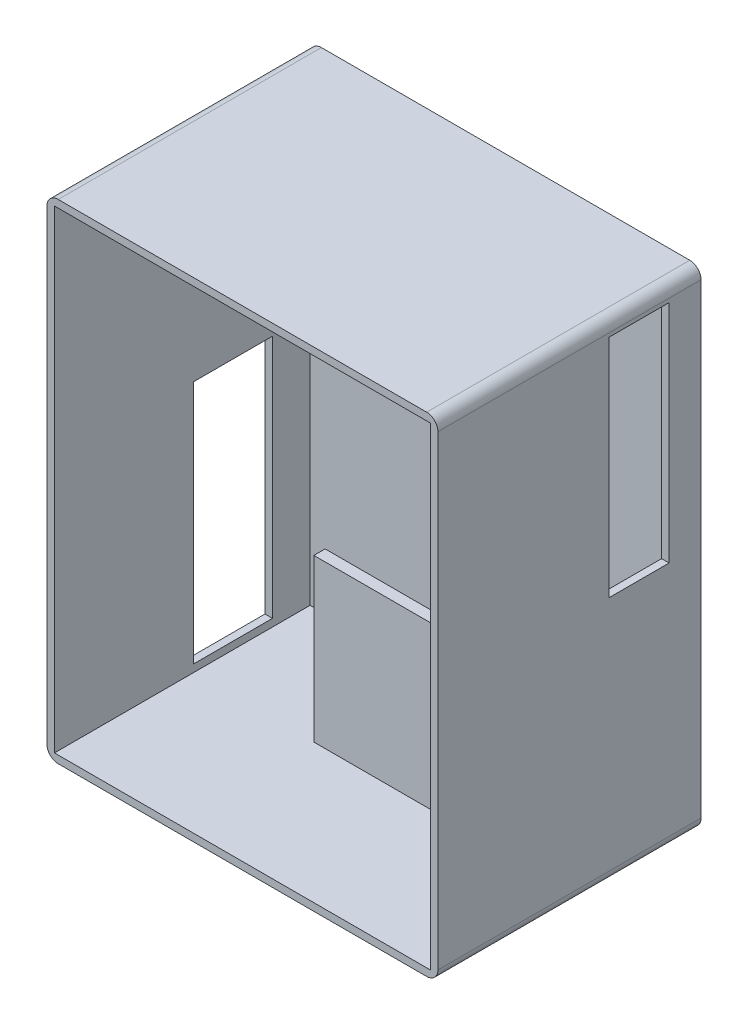
ISO-10303-21;
HEADER;
FILE_DESCRIPTION(('STEP AP214'),'2;1');
FILE_NAME('part.step','',(''),(''),'','','');
FILE_SCHEMA(('AUTOMOTIVE_DESIGN { 1 0 10303 214 1 1 1 1 }'));
ENDSEC;
DATA;
#1=APPLICATION_CONTEXT('core data for automotive mechanical design processes');
#2=APPLICATION_PROTOCOL_DEFINITION('international standard','automotive_design',2000,#1);
#3=PRODUCT_CONTEXT('',#1,'mechanical');
#4=PRODUCT('Part','Part','',(#3));
#5=PRODUCT_RELATED_PRODUCT_CATEGORY('part','',(#4));
#6=PRODUCT_DEFINITION_FORMATION('','',#4);
#7=PRODUCT_DEFINITION_CONTEXT('part definition',#1,'design');
#8=PRODUCT_DEFINITION('design','',#6,#7);
#9=PRODUCT_DEFINITION_SHAPE('','',#8);
#10=(LENGTH_UNIT() NAMED_UNIT(*) SI_UNIT(.MILLI.,.METRE.));
#11=(NAMED_UNIT(*) PLANE_ANGLE_UNIT() SI_UNIT($,.RADIAN.));
#12=(NAMED_UNIT(*) SI_UNIT($,.STERADIAN.) SOLID_ANGLE_UNIT());
#13=UNCERTAINTY_MEASURE_WITH_UNIT(LENGTH_MEASURE(1.E-05),#10,'distance_accuracy_value','');
#14=(GEOMETRIC_REPRESENTATION_CONTEXT(3) GLOBAL_UNCERTAINTY_ASSIGNED_CONTEXT((#13)) GLOBAL_UNIT_ASSIGNED_CONTEXT((#10,
#11,#12)) REPRESENTATION_CONTEXT('',''));
#15=CARTESIAN_POINT('',(0.,0.,0.));
#16=DIRECTION('',(0.,0.,1.));
#17=DIRECTION('',(1.,0.,0.));
#18=AXIS2_PLACEMENT_3D('',#15,#16,#17);
#19=CARTESIAN_POINT('',(52.,65.,70.));
#20=DIRECTION('',(-1.,0.,0.));
#21=DIRECTION('',(0.,-1.,0.));
#22=AXIS2_PLACEMENT_3D('',#19,#20,#21);
#23=PLANE('',#22);
#24=DIRECTION('',(0.,1.,0.));
#25=VECTOR('',#24,1.);
#26=CARTESIAN_POINT('',(52.,65.,0.));
#27=LINE('',#26,#25);
#28=CARTESIAN_POINT('',(52.,-62.,0.));
#29=VERTEX_POINT('',#28);
#30=CARTESIAN_POINT('',(52.,62.,0.));
#31=VERTEX_POINT('',#30);
#32=EDGE_CURVE('E307',#29,#31,#27,.T.);
#33=ORIENTED_EDGE('',*,*,#32,.T.);
#34=DIRECTION('',(0.,0.,-1.));
#35=VECTOR('',#34,1.);
#36=CARTESIAN_POINT('',(52.,62.,70.));
#37=LINE('',#36,#35);
#38=CARTESIAN_POINT('',(52.,62.,70.));
#39=VERTEX_POINT('',#38);
#40=EDGE_CURVE('E11',#31,#39,#37,.F.);
#41=ORIENTED_EDGE('',*,*,#40,.T.);
#42=DIRECTION('',(0.,1.,0.));
#43=VECTOR('',#42,1.);
#44=CARTESIAN_POINT('',(52.,65.,70.));
#45=LINE('',#44,#43);
#46=CARTESIAN_POINT('',(52.,-62.,70.));
#47=VERTEX_POINT('',#46);
#48=EDGE_CURVE('E343',#47,#39,#45,.T.);
#49=ORIENTED_EDGE('',*,*,#48,.F.);
#50=DIRECTION('',(0.,0.,-1.));
#51=VECTOR('',#50,1.);
#52=CARTESIAN_POINT('',(52.,-62.,70.));
#53=LINE('',#52,#51);
#54=EDGE_CURVE('E48',#47,#29,#53,.T.);
#55=ORIENTED_EDGE('',*,*,#54,.T.);
#56=EDGE_LOOP('',(#33,#41,#49,#55));
#57=FACE_BOUND('',#56,.T.);
#58=DIRECTION('',(0.,0.,1.));
#59=VECTOR('',#58,1.);
#60=CARTESIAN_POINT('',(52.,61.,24.5));
#61=LINE('',#60,#59);
#62=CARTESIAN_POINT('',(52.,61.,8.5));
#63=VERTEX_POINT('',#62);
#64=CARTESIAN_POINT('',(52.,61.,24.5));
#65=VERTEX_POINT('',#64);
#66=EDGE_CURVE('E245',#63,#65,#61,.T.);
#67=ORIENTED_EDGE('',*,*,#66,.F.);
#68=DIRECTION('',(0.,1.,0.));
#69=VECTOR('',#68,1.);
#70=CARTESIAN_POINT('',(52.,1.,8.5));
#71=LINE('',#70,#69);
#72=CARTESIAN_POINT('',(52.,1.,8.5));
#73=VERTEX_POINT('',#72);
#74=EDGE_CURVE('E242',#73,#63,#71,.T.);
#75=ORIENTED_EDGE('',*,*,#74,.F.);
#76=DIRECTION('',(0.,0.,-1.));
#77=VECTOR('',#76,1.);
#78=CARTESIAN_POINT('',(52.,1.,24.5));
#79=LINE('',#78,#77);
#80=CARTESIAN_POINT('',(52.,1.,24.5));
#81=VERTEX_POINT('',#80);
#82=EDGE_CURVE('E253',#81,#73,#79,.T.);
#83=ORIENTED_EDGE('',*,*,#82,.F.);
#84=DIRECTION('',(0.,-1.,0.));
#85=VECTOR('',#84,1.);
#86=CARTESIAN_POINT('',(52.,1.,24.5));
#87=LINE('',#86,#85);
#88=EDGE_CURVE('E249',#65,#81,#87,.T.);
#89=ORIENTED_EDGE('',*,*,#88,.F.);
#90=EDGE_LOOP('',(#67,#75,#83,#89));
#91=FACE_BOUND('',#90,.T.);
#92=ADVANCED_FACE('F39',(#57,#91),#23,.F.);
#93=CARTESIAN_POINT('',(-52.,65.,70.));
#94=DIRECTION('',(0.,-1.,0.));
#95=DIRECTION('',(0.,0.,-1.));
#96=AXIS2_PLACEMENT_3D('',#93,#94,#95);
#97=PLANE('',#96);
#98=DIRECTION('',(-1.,0.,0.));
#99=VECTOR('',#98,1.);
#100=CARTESIAN_POINT('',(-52.,65.,0.));
#101=LINE('',#100,#99);
#102=CARTESIAN_POINT('',(49.,65.,0.));
#103=VERTEX_POINT('',#102);
#104=CARTESIAN_POINT('',(-49.,65.,0.));
#105=VERTEX_POINT('',#104);
#106=EDGE_CURVE('E362',#103,#105,#101,.T.);
#107=ORIENTED_EDGE('',*,*,#106,.T.);
#108=DIRECTION('',(0.,0.,-1.));
#109=VECTOR('',#108,1.);
#110=CARTESIAN_POINT('',(-49.,65.,70.));
#111=LINE('',#110,#109);
#112=CARTESIAN_POINT('',(-49.,65.,70.));
#113=VERTEX_POINT('',#112);
#114=EDGE_CURVE('E55',#105,#113,#111,.F.);
#115=ORIENTED_EDGE('',*,*,#114,.T.);
#116=DIRECTION('',(-1.,0.,0.));
#117=VECTOR('',#116,1.);
#118=CARTESIAN_POINT('',(-52.,65.,70.));
#119=LINE('',#118,#117);
#120=CARTESIAN_POINT('',(49.,65.,70.));
#121=VERTEX_POINT('',#120);
#122=EDGE_CURVE('E346',#121,#113,#119,.T.);
#123=ORIENTED_EDGE('',*,*,#122,.F.);
#124=DIRECTION('',(0.,0.,-1.));
#125=VECTOR('',#124,1.);
#126=CARTESIAN_POINT('',(49.,65.,70.));
#127=LINE('',#126,#125);
#128=EDGE_CURVE('E445',#121,#103,#127,.T.);
#129=ORIENTED_EDGE('',*,*,#128,.T.);
#130=EDGE_LOOP('',(#107,#115,#123,#129));
#131=FACE_BOUND('',#130,.T.);
#132=ADVANCED_FACE('F467',(#131),#97,.F.);
#133=CARTESIAN_POINT('',(-52.,65.,70.));
#134=DIRECTION('',(1.,0.,0.));
#135=DIRECTION('',(0.,1.,0.));
#136=AXIS2_PLACEMENT_3D('',#133,#134,#135);
#137=PLANE('',#136);
#138=DIRECTION('',(0.,0.,1.));
#139=VECTOR('',#138,1.);
#140=CARTESIAN_POINT('',(-52.,-61.,33.));
#141=LINE('',#140,#139);
#142=CARTESIAN_POINT('',(-52.,-61.,12.));
#143=VERTEX_POINT('',#142);
#144=CARTESIAN_POINT('',(-52.,-61.,33.));
#145=VERTEX_POINT('',#144);
#146=EDGE_CURVE('E273',#143,#145,#141,.T.);
#147=ORIENTED_EDGE('',*,*,#146,.F.);
#148=DIRECTION('',(0.,-1.,0.));
#149=VECTOR('',#148,1.);
#150=CARTESIAN_POINT('',(-52.,4.,12.));
#151=LINE('',#150,#149);
#152=CARTESIAN_POINT('',(-52.,4.,12.));
#153=VERTEX_POINT('',#152);
#154=EDGE_CURVE('E261',#153,#143,#151,.T.);
#155=ORIENTED_EDGE('',*,*,#154,.F.);
#156=DIRECTION('',(0.,0.,-1.));
#157=VECTOR('',#156,1.);
#158=CARTESIAN_POINT('',(-52.,4.,33.));
#159=LINE('',#158,#157);
#160=CARTESIAN_POINT('',(-52.,4.,33.));
#161=VERTEX_POINT('',#160);
#162=EDGE_CURVE('E281',#161,#153,#159,.T.);
#163=ORIENTED_EDGE('',*,*,#162,.F.);
#164=DIRECTION('',(0.,1.,0.));
#165=VECTOR('',#164,1.);
#166=CARTESIAN_POINT('',(-52.,4.,33.));
#167=LINE('',#166,#165);
#168=EDGE_CURVE('E277',#145,#161,#167,.T.);
#169=ORIENTED_EDGE('',*,*,#168,.F.);
#170=EDGE_LOOP('',(#147,#155,#163,#169));
#171=FACE_BOUND('',#170,.T.);
#172=DIRECTION('',(0.,-1.,0.));
#173=VECTOR('',#172,1.);
#174=CARTESIAN_POINT('',(-52.,65.,0.));
#175=LINE('',#174,#173);
#176=CARTESIAN_POINT('',(-52.,62.,0.));
#177=VERTEX_POINT('',#176);
#178=CARTESIAN_POINT('',(-52.,-62.,0.));
#179=VERTEX_POINT('',#178);
#180=EDGE_CURVE('E365',#177,#179,#175,.T.);
#181=ORIENTED_EDGE('',*,*,#180,.T.);
#182=DIRECTION('',(0.,0.,-1.));
#183=VECTOR('',#182,1.);
#184=CARTESIAN_POINT('',(-52.,-62.,70.));
#185=LINE('',#184,#183);
#186=CARTESIAN_POINT('',(-52.,-62.,70.));
#187=VERTEX_POINT('',#186);
#188=EDGE_CURVE('E431',#179,#187,#185,.F.);
#189=ORIENTED_EDGE('',*,*,#188,.T.);
#190=DIRECTION('',(0.,-1.,0.));
#191=VECTOR('',#190,1.);
#192=CARTESIAN_POINT('',(-52.,65.,70.));
#193=LINE('',#192,#191);
#194=CARTESIAN_POINT('',(-52.,62.,70.));
#195=VERTEX_POINT('',#194);
#196=EDGE_CURVE('E350',#195,#187,#193,.T.);
#197=ORIENTED_EDGE('',*,*,#196,.F.);
#198=DIRECTION('',(0.,0.,-1.));
#199=VECTOR('',#198,1.);
#200=CARTESIAN_POINT('',(-52.,62.,70.));
#201=LINE('',#200,#199);
#202=EDGE_CURVE('E427',#195,#177,#201,.T.);
#203=ORIENTED_EDGE('',*,*,#202,.T.);
#204=EDGE_LOOP('',(#181,#189,#197,#203));
#205=FACE_BOUND('',#204,.T.);
#206=ADVANCED_FACE('F476',(#171,#205),#137,.F.);
#207=CARTESIAN_POINT('',(-52.,-65.,70.));
#208=DIRECTION('',(0.,1.,0.));
#209=DIRECTION('',(0.,0.,1.));
#210=AXIS2_PLACEMENT_3D('',#207,#208,#209);
#211=PLANE('',#210);
#212=DIRECTION('',(1.,0.,0.));
#213=VECTOR('',#212,1.);
#214=CARTESIAN_POINT('',(-52.,-65.,70.));
#215=LINE('',#214,#213);
#216=CARTESIAN_POINT('',(-49.,-65.,70.));
#217=VERTEX_POINT('',#216);
#218=CARTESIAN_POINT('',(49.,-65.,70.));
#219=VERTEX_POINT('',#218);
#220=EDGE_CURVE('E354',#217,#219,#215,.T.);
#221=ORIENTED_EDGE('',*,*,#220,.F.);
#222=DIRECTION('',(0.,0.,-1.));
#223=VECTOR('',#222,1.);
#224=CARTESIAN_POINT('',(-49.,-65.,70.));
#225=LINE('',#224,#223);
#226=CARTESIAN_POINT('',(-49.,-65.,0.));
#227=VERTEX_POINT('',#226);
#228=EDGE_CURVE('E411',#217,#227,#225,.T.);
#229=ORIENTED_EDGE('',*,*,#228,.T.);
#230=DIRECTION('',(1.,0.,0.));
#231=VECTOR('',#230,1.);
#232=CARTESIAN_POINT('',(-52.,-65.,0.));
#233=LINE('',#232,#231);
#234=CARTESIAN_POINT('',(49.,-65.,0.));
#235=VERTEX_POINT('',#234);
#236=EDGE_CURVE('E347',#227,#235,#233,.T.);
#237=ORIENTED_EDGE('',*,*,#236,.T.);
#238=DIRECTION('',(0.,0.,-1.));
#239=VECTOR('',#238,1.);
#240=CARTESIAN_POINT('',(49.,-65.,70.));
#241=LINE('',#240,#239);
#242=EDGE_CURVE('E408',#235,#219,#241,.F.);
#243=ORIENTED_EDGE('',*,*,#242,.T.);
#244=EDGE_LOOP('',(#221,#229,#237,#243));
#245=FACE_BOUND('',#244,.T.);
#246=ADVANCED_FACE('F484',(#245),#211,.F.);
#247=CARTESIAN_POINT('',(0.,0.,70.));
#248=DIRECTION('',(0.,0.,1.));
#249=DIRECTION('',(1.,0.,0.));
#250=AXIS2_PLACEMENT_3D('',#247,#248,#249);
#251=PLANE('',#250);
#252=DIRECTION('',(0.,1.,0.));
#253=VECTOR('',#252,1.);
#254=CARTESIAN_POINT('',(50.,65.,70.));
#255=LINE('',#254,#253);
#256=CARTESIAN_POINT('',(50.,-63.,70.));
#257=VERTEX_POINT('',#256);
#258=CARTESIAN_POINT('',(50.,63.,70.));
#259=VERTEX_POINT('',#258);
#260=EDGE_CURVE('E330',#257,#259,#255,.T.);
#261=ORIENTED_EDGE('',*,*,#260,.F.);
#262=DIRECTION('',(1.,0.,0.));
#263=VECTOR('',#262,1.);
#264=CARTESIAN_POINT('',(-52.,-63.,70.));
#265=LINE('',#264,#263);
#266=CARTESIAN_POINT('',(-50.,-63.,70.));
#267=VERTEX_POINT('',#266);
#268=EDGE_CURVE('E340',#267,#257,#265,.T.);
#269=ORIENTED_EDGE('',*,*,#268,.F.);
#270=DIRECTION('',(0.,-1.,0.));
#271=VECTOR('',#270,1.);
#272=CARTESIAN_POINT('',(-50.,65.,70.));
#273=LINE('',#272,#271);
#274=CARTESIAN_POINT('',(-50.,63.,70.));
#275=VERTEX_POINT('',#274);
#276=EDGE_CURVE('E336',#275,#267,#273,.T.);
#277=ORIENTED_EDGE('',*,*,#276,.F.);
#278=DIRECTION('',(-1.,0.,0.));
#279=VECTOR('',#278,1.);
#280=CARTESIAN_POINT('',(-52.,63.,70.));
#281=LINE('',#280,#279);
#282=EDGE_CURVE('E333',#259,#275,#281,.T.);
#283=ORIENTED_EDGE('',*,*,#282,.F.);
#284=EDGE_LOOP('',(#261,#269,#277,#283));
#285=FACE_BOUND('',#284,.T.);
#286=ORIENTED_EDGE('',*,*,#196,.T.);
#287=CARTESIAN_POINT('',(-49.,-62.,70.));
#288=DIRECTION('',(0.,0.,1.));
#289=DIRECTION('',(1.,0.,0.));
#290=AXIS2_PLACEMENT_3D('',#287,#288,#289);
#291=CIRCLE('',#290,3.);
#292=EDGE_CURVE('E442',#187,#217,#291,.T.);
#293=ORIENTED_EDGE('',*,*,#292,.T.);
#294=ORIENTED_EDGE('',*,*,#220,.T.);
#295=CARTESIAN_POINT('',(49.,-62.,70.));
#296=DIRECTION('',(0.,0.,1.));
#297=DIRECTION('',(1.,0.,0.));
#298=AXIS2_PLACEMENT_3D('',#295,#296,#297);
#299=CIRCLE('',#298,3.);
#300=EDGE_CURVE('E434',#219,#47,#299,.T.);
#301=ORIENTED_EDGE('',*,*,#300,.T.);
#302=ORIENTED_EDGE('',*,*,#48,.T.);
#303=CARTESIAN_POINT('',(49.,62.,70.));
#304=DIRECTION('',(0.,0.,1.));
#305=DIRECTION('',(1.,0.,0.));
#306=AXIS2_PLACEMENT_3D('',#303,#304,#305);
#307=CIRCLE('',#306,3.);
#308=EDGE_CURVE('E62',#39,#121,#307,.T.);
#309=ORIENTED_EDGE('',*,*,#308,.T.);
#310=ORIENTED_EDGE('',*,*,#122,.T.);
#311=CARTESIAN_POINT('',(-49.,62.,70.));
#312=DIRECTION('',(0.,0.,1.));
#313=DIRECTION('',(1.,0.,0.));
#314=AXIS2_PLACEMENT_3D('',#311,#312,#313);
#315=CIRCLE('',#314,3.);
#316=EDGE_CURVE('E439',#113,#195,#315,.T.);
#317=ORIENTED_EDGE('',*,*,#316,.T.);
#318=EDGE_LOOP('',(#286,#293,#294,#301,#302,#309,#310,#317));
#319=FACE_BOUND('',#318,.T.);
#320=ADVANCED_FACE('F469',(#285,#319),#251,.T.);
#321=CARTESIAN_POINT('',(0.,0.,0.));
#322=DIRECTION('',(0.,0.,1.));
#323=DIRECTION('',(1.,0.,0.));
#324=AXIS2_PLACEMENT_3D('',#321,#322,#323);
#325=PLANE('',#324);
#326=ORIENTED_EDGE('',*,*,#236,.F.);
#327=CARTESIAN_POINT('',(-49.,-62.,0.));
#328=DIRECTION('',(0.,0.,1.));
#329=DIRECTION('',(1.,0.,0.));
#330=AXIS2_PLACEMENT_3D('',#327,#328,#329);
#331=CIRCLE('',#330,3.);
#332=EDGE_CURVE('E424',#227,#179,#331,.F.);
#333=ORIENTED_EDGE('',*,*,#332,.T.);
#334=ORIENTED_EDGE('',*,*,#180,.F.);
#335=CARTESIAN_POINT('',(-49.,62.,0.));
#336=DIRECTION('',(0.,0.,1.));
#337=DIRECTION('',(1.,0.,0.));
#338=AXIS2_PLACEMENT_3D('',#335,#336,#337);
#339=CIRCLE('',#338,3.);
#340=EDGE_CURVE('E421',#177,#105,#339,.F.);
#341=ORIENTED_EDGE('',*,*,#340,.T.);
#342=ORIENTED_EDGE('',*,*,#106,.F.);
#343=CARTESIAN_POINT('',(49.,62.,0.));
#344=DIRECTION('',(0.,0.,1.));
#345=DIRECTION('',(1.,0.,0.));
#346=AXIS2_PLACEMENT_3D('',#343,#344,#345);
#347=CIRCLE('',#346,3.);
#348=EDGE_CURVE('E418',#103,#31,#347,.F.);
#349=ORIENTED_EDGE('',*,*,#348,.T.);
#350=ORIENTED_EDGE('',*,*,#32,.F.);
#351=CARTESIAN_POINT('',(49.,-62.,0.));
#352=DIRECTION('',(0.,0.,1.));
#353=DIRECTION('',(1.,0.,0.));
#354=AXIS2_PLACEMENT_3D('',#351,#352,#353);
#355=CIRCLE('',#354,3.);
#356=EDGE_CURVE('E415',#29,#235,#355,.F.);
#357=ORIENTED_EDGE('',*,*,#356,.T.);
#358=EDGE_LOOP('',(#326,#333,#334,#341,#342,#349,#350,#357));
#359=FACE_BOUND('',#358,.T.);
#360=ADVANCED_FACE('F462',(#359),#325,.F.);
#361=CARTESIAN_POINT('',(50.,65.,70.));
#362=DIRECTION('',(-1.,0.,0.));
#363=DIRECTION('',(0.,-1.,0.));
#364=AXIS2_PLACEMENT_3D('',#361,#362,#363);
#365=PLANE('',#364);
#366=DIRECTION('',(0.,-1.,0.));
#367=VECTOR('',#366,1.);
#368=CARTESIAN_POINT('',(50.,65.,30.));
#369=LINE('',#368,#367);
#370=CARTESIAN_POINT('',(50.,-20.,30.));
#371=VERTEX_POINT('',#370);
#372=CARTESIAN_POINT('',(50.,-63.,30.));
#373=VERTEX_POINT('',#372);
#374=EDGE_CURVE('E239',#371,#373,#369,.T.);
#375=ORIENTED_EDGE('',*,*,#374,.F.);
#376=DIRECTION('',(0.,0.,-1.));
#377=VECTOR('',#376,1.);
#378=CARTESIAN_POINT('',(50.,-20.,70.));
#379=LINE('',#378,#377);
#380=CARTESIAN_POINT('',(50.,-20.,33.));
#381=VERTEX_POINT('',#380);
#382=EDGE_CURVE('E220',#381,#371,#379,.T.);
#383=ORIENTED_EDGE('',*,*,#382,.F.);
#384=DIRECTION('',(0.,1.,0.));
#385=VECTOR('',#384,1.);
#386=CARTESIAN_POINT('',(50.,65.,33.));
#387=LINE('',#386,#385);
#388=CARTESIAN_POINT('',(50.,-63.,33.));
#389=VERTEX_POINT('',#388);
#390=EDGE_CURVE('E234',#389,#381,#387,.T.);
#391=ORIENTED_EDGE('',*,*,#390,.F.);
#392=DIRECTION('',(0.,0.,-1.));
#393=VECTOR('',#392,1.);
#394=CARTESIAN_POINT('',(50.,-63.,70.));
#395=LINE('',#394,#393);
#396=EDGE_CURVE('E309',#257,#389,#395,.T.);
#397=ORIENTED_EDGE('',*,*,#396,.F.);
#398=ORIENTED_EDGE('',*,*,#260,.T.);
#399=DIRECTION('',(0.,0.,-1.));
#400=VECTOR('',#399,1.);
#401=CARTESIAN_POINT('',(50.,63.,70.));
#402=LINE('',#401,#400);
#403=CARTESIAN_POINT('',(50.,63.,2.));
#404=VERTEX_POINT('',#403);
#405=EDGE_CURVE('E303',#259,#404,#402,.T.);
#406=ORIENTED_EDGE('',*,*,#405,.T.);
#407=DIRECTION('',(0.,1.,0.));
#408=VECTOR('',#407,1.);
#409=CARTESIAN_POINT('',(50.,65.,2.));
#410=LINE('',#409,#408);
#411=CARTESIAN_POINT('',(50.,-63.,2.));
#412=VERTEX_POINT('',#411);
#413=EDGE_CURVE('E289',#412,#404,#410,.T.);
#414=ORIENTED_EDGE('',*,*,#413,.F.);
#415=EDGE_CURVE('E314',#373,#412,#395,.T.);
#416=ORIENTED_EDGE('',*,*,#415,.F.);
#417=EDGE_LOOP('',(#375,#383,#391,#397,#398,#406,#414,#416));
#418=FACE_BOUND('',#417,.T.);
#419=DIRECTION('',(0.,-1.,0.));
#420=VECTOR('',#419,1.);
#421=CARTESIAN_POINT('',(50.,65.,8.5));
#422=LINE('',#421,#420);
#423=CARTESIAN_POINT('',(50.,61.,8.5));
#424=VERTEX_POINT('',#423);
#425=CARTESIAN_POINT('',(50.,1.,8.5));
#426=VERTEX_POINT('',#425);
#427=EDGE_CURVE('E394',#424,#426,#422,.T.);
#428=ORIENTED_EDGE('',*,*,#427,.F.);
#429=DIRECTION('',(0.,0.,-1.));
#430=VECTOR('',#429,1.);
#431=CARTESIAN_POINT('',(50.,61.,70.));
#432=LINE('',#431,#430);
#433=CARTESIAN_POINT('',(50.,61.,24.5));
#434=VERTEX_POINT('',#433);
#435=EDGE_CURVE('E384',#434,#424,#432,.T.);
#436=ORIENTED_EDGE('',*,*,#435,.F.);
#437=DIRECTION('',(0.,1.,0.));
#438=VECTOR('',#437,1.);
#439=CARTESIAN_POINT('',(50.,65.,24.5));
#440=LINE('',#439,#438);
#441=CARTESIAN_POINT('',(50.,1.,24.5));
#442=VERTEX_POINT('',#441);
#443=EDGE_CURVE('E387',#442,#434,#440,.T.);
#444=ORIENTED_EDGE('',*,*,#443,.F.);
#445=DIRECTION('',(0.,0.,1.));
#446=VECTOR('',#445,1.);
#447=CARTESIAN_POINT('',(50.,1.,70.));
#448=LINE('',#447,#446);
#449=EDGE_CURVE('E391',#426,#442,#448,.T.);
#450=ORIENTED_EDGE('',*,*,#449,.F.);
#451=EDGE_LOOP('',(#428,#436,#444,#450));
#452=FACE_BOUND('',#451,.T.);
#453=ADVANCED_FACE('F661',(#418,#452),#365,.T.);
#454=CARTESIAN_POINT('',(-52.,63.,70.));
#455=DIRECTION('',(0.,-1.,0.));
#456=DIRECTION('',(0.,0.,-1.));
#457=AXIS2_PLACEMENT_3D('',#454,#455,#456);
#458=PLANE('',#457);
#459=DIRECTION('',(-1.,0.,0.));
#460=VECTOR('',#459,1.);
#461=CARTESIAN_POINT('',(-52.,63.,2.));
#462=LINE('',#461,#460);
#463=CARTESIAN_POINT('',(-50.,63.,2.));
#464=VERTEX_POINT('',#463);
#465=EDGE_CURVE('E302',#404,#464,#462,.T.);
#466=ORIENTED_EDGE('',*,*,#465,.F.);
#467=ORIENTED_EDGE('',*,*,#405,.F.);
#468=ORIENTED_EDGE('',*,*,#282,.T.);
#469=DIRECTION('',(0.,0.,-1.));
#470=VECTOR('',#469,1.);
#471=CARTESIAN_POINT('',(-50.,63.,70.));
#472=LINE('',#471,#470);
#473=EDGE_CURVE('E308',#275,#464,#472,.T.);
#474=ORIENTED_EDGE('',*,*,#473,.T.);
#475=EDGE_LOOP('',(#466,#467,#468,#474));
#476=FACE_BOUND('',#475,.T.);
#477=ADVANCED_FACE('F653',(#476),#458,.T.);
#478=CARTESIAN_POINT('',(-50.,65.,70.));
#479=DIRECTION('',(1.,0.,0.));
#480=DIRECTION('',(0.,1.,0.));
#481=AXIS2_PLACEMENT_3D('',#478,#479,#480);
#482=PLANE('',#481);
#483=DIRECTION('',(0.,1.,0.));
#484=VECTOR('',#483,1.);
#485=CARTESIAN_POINT('',(-50.,65.,12.));
#486=LINE('',#485,#484);
#487=CARTESIAN_POINT('',(-50.,-61.,12.));
#488=VERTEX_POINT('',#487);
#489=CARTESIAN_POINT('',(-50.,4.,12.));
#490=VERTEX_POINT('',#489);
#491=EDGE_CURVE('E381',#488,#490,#486,.T.);
#492=ORIENTED_EDGE('',*,*,#491,.F.);
#493=DIRECTION('',(0.,0.,-1.));
#494=VECTOR('',#493,1.);
#495=CARTESIAN_POINT('',(-50.,-61.,70.));
#496=LINE('',#495,#494);
#497=CARTESIAN_POINT('',(-50.,-61.,33.));
#498=VERTEX_POINT('',#497);
#499=EDGE_CURVE('E358',#498,#488,#496,.T.);
#500=ORIENTED_EDGE('',*,*,#499,.F.);
#501=DIRECTION('',(0.,-1.,0.));
#502=VECTOR('',#501,1.);
#503=CARTESIAN_POINT('',(-50.,65.,33.));
#504=LINE('',#503,#502);
#505=CARTESIAN_POINT('',(-50.,4.,33.));
#506=VERTEX_POINT('',#505);
#507=EDGE_CURVE('E374',#506,#498,#504,.T.);
#508=ORIENTED_EDGE('',*,*,#507,.F.);
#509=DIRECTION('',(0.,0.,1.));
#510=VECTOR('',#509,1.);
#511=CARTESIAN_POINT('',(-50.,4.,70.));
#512=LINE('',#511,#510);
#513=EDGE_CURVE('E378',#490,#506,#512,.T.);
#514=ORIENTED_EDGE('',*,*,#513,.F.);
#515=EDGE_LOOP('',(#492,#500,#508,#514));
#516=FACE_BOUND('',#515,.T.);
#517=DIRECTION('',(0.,-1.,0.));
#518=VECTOR('',#517,1.);
#519=CARTESIAN_POINT('',(-50.,65.,2.));
#520=LINE('',#519,#518);
#521=CARTESIAN_POINT('',(-50.,-63.,2.));
#522=VERTEX_POINT('',#521);
#523=EDGE_CURVE('E317',#464,#522,#520,.T.);
#524=ORIENTED_EDGE('',*,*,#523,.F.);
#525=ORIENTED_EDGE('',*,*,#473,.F.);
#526=ORIENTED_EDGE('',*,*,#276,.T.);
#527=DIRECTION('',(0.,0.,-1.));
#528=VECTOR('',#527,1.);
#529=CARTESIAN_POINT('',(-50.,-63.,70.));
#530=LINE('',#529,#528);
#531=EDGE_CURVE('E313',#267,#522,#530,.T.);
#532=ORIENTED_EDGE('',*,*,#531,.T.);
#533=EDGE_LOOP('',(#524,#525,#526,#532));
#534=FACE_BOUND('',#533,.T.);
#535=ADVANCED_FACE('F645',(#516,#534),#482,.T.);
#536=CARTESIAN_POINT('',(-52.,-63.,70.));
#537=DIRECTION('',(0.,1.,0.));
#538=DIRECTION('',(0.,0.,1.));
#539=AXIS2_PLACEMENT_3D('',#536,#537,#538);
#540=PLANE('',#539);
#541=DIRECTION('',(-1.,0.,0.));
#542=VECTOR('',#541,1.);
#543=CARTESIAN_POINT('',(-52.,-63.,30.));
#544=LINE('',#543,#542);
#545=CARTESIAN_POINT('',(-18.,-63.,30.));
#546=VERTEX_POINT('',#545);
#547=EDGE_CURVE('E208',#373,#546,#544,.T.);
#548=ORIENTED_EDGE('',*,*,#547,.F.);
#549=ORIENTED_EDGE('',*,*,#415,.T.);
#550=DIRECTION('',(1.,0.,0.));
#551=VECTOR('',#550,1.);
#552=CARTESIAN_POINT('',(-52.,-63.,2.));
#553=LINE('',#552,#551);
#554=EDGE_CURVE('E323',#522,#412,#553,.T.);
#555=ORIENTED_EDGE('',*,*,#554,.F.);
#556=ORIENTED_EDGE('',*,*,#531,.F.);
#557=ORIENTED_EDGE('',*,*,#268,.T.);
#558=ORIENTED_EDGE('',*,*,#396,.T.);
#559=DIRECTION('',(1.,0.,0.));
#560=VECTOR('',#559,1.);
#561=CARTESIAN_POINT('',(-52.,-63.,33.));
#562=LINE('',#561,#560);
#563=CARTESIAN_POINT('',(-18.,-63.,33.));
#564=VERTEX_POINT('',#563);
#565=EDGE_CURVE('E400',#564,#389,#562,.T.);
#566=ORIENTED_EDGE('',*,*,#565,.F.);
#567=DIRECTION('',(0.,0.,1.));
#568=VECTOR('',#567,1.);
#569=CARTESIAN_POINT('',(-18.,-63.,70.));
#570=LINE('',#569,#568);
#571=EDGE_CURVE('E397',#546,#564,#570,.T.);
#572=ORIENTED_EDGE('',*,*,#571,.F.);
#573=EDGE_LOOP('',(#548,#549,#555,#556,#557,#558,#566,#572));
#574=FACE_BOUND('',#573,.T.);
#575=ADVANCED_FACE('F636',(#574),#540,.T.);
#576=CARTESIAN_POINT('',(0.,0.,2.));
#577=DIRECTION('',(0.,0.,1.));
#578=DIRECTION('',(1.,0.,0.));
#579=AXIS2_PLACEMENT_3D('',#576,#577,#578);
#580=PLANE('',#579);
#581=ORIENTED_EDGE('',*,*,#413,.T.);
#582=ORIENTED_EDGE('',*,*,#465,.T.);
#583=ORIENTED_EDGE('',*,*,#523,.T.);
#584=ORIENTED_EDGE('',*,*,#554,.T.);
#585=EDGE_LOOP('',(#581,#582,#583,#584));
#586=FACE_BOUND('',#585,.T.);
#587=ADVANCED_FACE('F626',(#586),#580,.T.);
#588=CARTESIAN_POINT('',(18.,4.,12.));
#589=DIRECTION('',(0.,0.,-1.));
#590=DIRECTION('',(0.,1.,0.));
#591=AXIS2_PLACEMENT_3D('',#588,#589,#590);
#592=PLANE('',#591);
#593=ORIENTED_EDGE('',*,*,#491,.T.);
#594=DIRECTION('',(-1.,0.,0.));
#595=VECTOR('',#594,1.);
#596=CARTESIAN_POINT('',(18.,4.,12.));
#597=LINE('',#596,#595);
#598=EDGE_CURVE('E286',#490,#153,#597,.T.);
#599=ORIENTED_EDGE('',*,*,#598,.T.);
#600=ORIENTED_EDGE('',*,*,#154,.T.);
#601=DIRECTION('',(-1.,0.,0.));
#602=VECTOR('',#601,1.);
#603=CARTESIAN_POINT('',(18.,-61.,12.));
#604=LINE('',#603,#602);
#605=EDGE_CURVE('E285',#488,#143,#604,.T.);
#606=ORIENTED_EDGE('',*,*,#605,.F.);
#607=EDGE_LOOP('',(#593,#599,#600,#606));
#608=FACE_BOUND('',#607,.T.);
#609=ADVANCED_FACE('F617',(#608),#592,.F.);
#610=CARTESIAN_POINT('',(18.,4.,33.));
#611=DIRECTION('',(0.,1.,0.));
#612=DIRECTION('',(0.,0.,1.));
#613=AXIS2_PLACEMENT_3D('',#610,#611,#612);
#614=PLANE('',#613);
#615=ORIENTED_EDGE('',*,*,#513,.T.);
#616=DIRECTION('',(-1.,0.,0.));
#617=VECTOR('',#616,1.);
#618=CARTESIAN_POINT('',(18.,4.,33.));
#619=LINE('',#618,#617);
#620=EDGE_CURVE('E290',#506,#161,#619,.T.);
#621=ORIENTED_EDGE('',*,*,#620,.T.);
#622=ORIENTED_EDGE('',*,*,#162,.T.);
#623=ORIENTED_EDGE('',*,*,#598,.F.);
#624=EDGE_LOOP('',(#615,#621,#622,#623));
#625=FACE_BOUND('',#624,.T.);
#626=ADVANCED_FACE('F608',(#625),#614,.F.);
#627=CARTESIAN_POINT('',(18.,4.,33.));
#628=DIRECTION('',(0.,0.,1.));
#629=DIRECTION('',(0.,-1.,0.));
#630=AXIS2_PLACEMENT_3D('',#627,#628,#629);
#631=PLANE('',#630);
#632=ORIENTED_EDGE('',*,*,#507,.T.);
#633=DIRECTION('',(-1.,0.,0.));
#634=VECTOR('',#633,1.);
#635=CARTESIAN_POINT('',(18.,-61.,33.));
#636=LINE('',#635,#634);
#637=EDGE_CURVE('E293',#498,#145,#636,.T.);
#638=ORIENTED_EDGE('',*,*,#637,.T.);
#639=ORIENTED_EDGE('',*,*,#168,.T.);
#640=ORIENTED_EDGE('',*,*,#620,.F.);
#641=EDGE_LOOP('',(#632,#638,#639,#640));
#642=FACE_BOUND('',#641,.T.);
#643=ADVANCED_FACE('F599',(#642),#631,.F.);
#644=CARTESIAN_POINT('',(18.,-61.,33.));
#645=DIRECTION('',(0.,-1.,0.));
#646=DIRECTION('',(1.,0.,0.));
#647=AXIS2_PLACEMENT_3D('',#644,#645,#646);
#648=PLANE('',#647);
#649=ORIENTED_EDGE('',*,*,#499,.T.);
#650=ORIENTED_EDGE('',*,*,#605,.T.);
#651=ORIENTED_EDGE('',*,*,#146,.T.);
#652=ORIENTED_EDGE('',*,*,#637,.F.);
#653=EDGE_LOOP('',(#649,#650,#651,#652));
#654=FACE_BOUND('',#653,.T.);
#655=ADVANCED_FACE('F590',(#654),#648,.F.);
#656=CARTESIAN_POINT('',(-18.,1.,8.5));
#657=DIRECTION('',(0.,0.,-1.));
#658=DIRECTION('',(-1.,0.,0.));
#659=AXIS2_PLACEMENT_3D('',#656,#657,#658);
#660=PLANE('',#659);
#661=ORIENTED_EDGE('',*,*,#427,.T.);
#662=DIRECTION('',(1.,0.,0.));
#663=VECTOR('',#662,1.);
#664=CARTESIAN_POINT('',(-18.,1.,8.5));
#665=LINE('',#664,#663);
#666=EDGE_CURVE('E258',#426,#73,#665,.T.);
#667=ORIENTED_EDGE('',*,*,#666,.T.);
#668=ORIENTED_EDGE('',*,*,#74,.T.);
#669=DIRECTION('',(1.,0.,0.));
#670=VECTOR('',#669,1.);
#671=CARTESIAN_POINT('',(-18.,61.,8.5));
#672=LINE('',#671,#670);
#673=EDGE_CURVE('E257',#424,#63,#672,.T.);
#674=ORIENTED_EDGE('',*,*,#673,.F.);
#675=EDGE_LOOP('',(#661,#667,#668,#674));
#676=FACE_BOUND('',#675,.T.);
#677=ADVANCED_FACE('F581',(#676),#660,.F.);
#678=CARTESIAN_POINT('',(-18.,1.,24.5));
#679=DIRECTION('',(0.,-1.,0.));
#680=DIRECTION('',(1.,0.,0.));
#681=AXIS2_PLACEMENT_3D('',#678,#679,#680);
#682=PLANE('',#681);
#683=ORIENTED_EDGE('',*,*,#449,.T.);
#684=DIRECTION('',(1.,0.,0.));
#685=VECTOR('',#684,1.);
#686=CARTESIAN_POINT('',(-18.,1.,24.5));
#687=LINE('',#686,#685);
#688=EDGE_CURVE('E262',#442,#81,#687,.T.);
#689=ORIENTED_EDGE('',*,*,#688,.T.);
#690=ORIENTED_EDGE('',*,*,#82,.T.);
#691=ORIENTED_EDGE('',*,*,#666,.F.);
#692=EDGE_LOOP('',(#683,#689,#690,#691));
#693=FACE_BOUND('',#692,.T.);
#694=ADVANCED_FACE('F572',(#693),#682,.F.);
#695=CARTESIAN_POINT('',(-18.,1.,24.5));
#696=DIRECTION('',(0.,0.,1.));
#697=DIRECTION('',(1.,0.,0.));
#698=AXIS2_PLACEMENT_3D('',#695,#696,#697);
#699=PLANE('',#698);
#700=ORIENTED_EDGE('',*,*,#443,.T.);
#701=DIRECTION('',(1.,0.,0.));
#702=VECTOR('',#701,1.);
#703=CARTESIAN_POINT('',(-18.,61.,24.5));
#704=LINE('',#703,#702);
#705=EDGE_CURVE('E265',#434,#65,#704,.T.);
#706=ORIENTED_EDGE('',*,*,#705,.T.);
#707=ORIENTED_EDGE('',*,*,#88,.T.);
#708=ORIENTED_EDGE('',*,*,#688,.F.);
#709=EDGE_LOOP('',(#700,#706,#707,#708));
#710=FACE_BOUND('',#709,.T.);
#711=ADVANCED_FACE('F562',(#710),#699,.F.);
#712=CARTESIAN_POINT('',(-18.,61.,24.5));
#713=DIRECTION('',(0.,1.,0.));
#714=DIRECTION('',(-1.,0.,0.));
#715=AXIS2_PLACEMENT_3D('',#712,#713,#714);
#716=PLANE('',#715);
#717=ORIENTED_EDGE('',*,*,#435,.T.);
#718=ORIENTED_EDGE('',*,*,#673,.T.);
#719=ORIENTED_EDGE('',*,*,#66,.T.);
#720=ORIENTED_EDGE('',*,*,#705,.F.);
#721=EDGE_LOOP('',(#717,#718,#719,#720));
#722=FACE_BOUND('',#721,.T.);
#723=ADVANCED_FACE('F553',(#722),#716,.F.);
#724=CARTESIAN_POINT('',(-18.,-65.,30.));
#725=DIRECTION('',(0.,0.,-1.));
#726=DIRECTION('',(-1.,0.,0.));
#727=AXIS2_PLACEMENT_3D('',#724,#725,#726);
#728=PLANE('',#727);
#729=DIRECTION('',(1.,0.,0.));
#730=VECTOR('',#729,1.);
#731=CARTESIAN_POINT('',(-18.,-20.,30.));
#732=LINE('',#731,#730);
#733=CARTESIAN_POINT('',(-18.,-20.,30.));
#734=VERTEX_POINT('',#733);
#735=EDGE_CURVE('E207',#734,#371,#732,.T.);
#736=ORIENTED_EDGE('',*,*,#735,.T.);
#737=ORIENTED_EDGE('',*,*,#374,.T.);
#738=ORIENTED_EDGE('',*,*,#547,.T.);
#739=DIRECTION('',(0.,1.,0.));
#740=VECTOR('',#739,1.);
#741=CARTESIAN_POINT('',(-18.,-65.,30.));
#742=LINE('',#741,#740);
#743=EDGE_CURVE('E203',#546,#734,#742,.T.);
#744=ORIENTED_EDGE('',*,*,#743,.T.);
#745=EDGE_LOOP('',(#736,#737,#738,#744));
#746=FACE_BOUND('',#745,.T.);
#747=ADVANCED_FACE('F205',(#746),#728,.T.);
#748=CARTESIAN_POINT('',(-18.,-65.,33.));
#749=DIRECTION('',(0.,0.,1.));
#750=DIRECTION('',(0.,-1.,0.));
#751=AXIS2_PLACEMENT_3D('',#748,#749,#750);
#752=PLANE('',#751);
#753=ORIENTED_EDGE('',*,*,#565,.T.);
#754=ORIENTED_EDGE('',*,*,#390,.T.);
#755=DIRECTION('',(1.,0.,0.));
#756=VECTOR('',#755,1.);
#757=CARTESIAN_POINT('',(-18.,-20.,33.));
#758=LINE('',#757,#756);
#759=CARTESIAN_POINT('',(-18.,-20.,33.));
#760=VERTEX_POINT('',#759);
#761=EDGE_CURVE('E222',#760,#381,#758,.T.);
#762=ORIENTED_EDGE('',*,*,#761,.F.);
#763=DIRECTION('',(0.,-1.,0.));
#764=VECTOR('',#763,1.);
#765=CARTESIAN_POINT('',(-18.,-65.,33.));
#766=LINE('',#765,#764);
#767=EDGE_CURVE('E223',#760,#564,#766,.T.);
#768=ORIENTED_EDGE('',*,*,#767,.T.);
#769=EDGE_LOOP('',(#753,#754,#762,#768));
#770=FACE_BOUND('',#769,.T.);
#771=ADVANCED_FACE('F537',(#770),#752,.T.);
#772=CARTESIAN_POINT('',(-18.,-20.,33.));
#773=DIRECTION('',(0.,1.,0.));
#774=DIRECTION('',(-1.,0.,0.));
#775=AXIS2_PLACEMENT_3D('',#772,#773,#774);
#776=PLANE('',#775);
#777=ORIENTED_EDGE('',*,*,#761,.T.);
#778=ORIENTED_EDGE('',*,*,#382,.T.);
#779=ORIENTED_EDGE('',*,*,#735,.F.);
#780=DIRECTION('',(0.,0.,1.));
#781=VECTOR('',#780,1.);
#782=CARTESIAN_POINT('',(-18.,-20.,33.));
#783=LINE('',#782,#781);
#784=EDGE_CURVE('E213',#734,#760,#783,.T.);
#785=ORIENTED_EDGE('',*,*,#784,.T.);
#786=EDGE_LOOP('',(#777,#778,#779,#785));
#787=FACE_BOUND('',#786,.T.);
#788=ADVANCED_FACE('F219',(#787),#776,.T.);
#789=CARTESIAN_POINT('',(-18.,0.,0.));
#790=DIRECTION('',(-1.,0.,0.));
#791=DIRECTION('',(0.,0.,1.));
#792=AXIS2_PLACEMENT_3D('',#789,#790,#791);
#793=PLANE('',#792);
#794=ORIENTED_EDGE('',*,*,#743,.F.);
#795=ORIENTED_EDGE('',*,*,#571,.T.);
#796=ORIENTED_EDGE('',*,*,#767,.F.);
#797=ORIENTED_EDGE('',*,*,#784,.F.);
#798=EDGE_LOOP('',(#794,#795,#796,#797));
#799=FACE_BOUND('',#798,.T.);
#800=ADVANCED_FACE('F226',(#799),#793,.T.);
#801=CARTESIAN_POINT('',(-49.,-62.,70.));
#802=DIRECTION('',(0.,0.,-1.));
#803=DIRECTION('',(-1.,0.,0.));
#804=AXIS2_PLACEMENT_3D('',#801,#802,#803);
#805=CYLINDRICAL_SURFACE('',#804,3.);
#806=ORIENTED_EDGE('',*,*,#292,.F.);
#807=ORIENTED_EDGE('',*,*,#188,.F.);
#808=ORIENTED_EDGE('',*,*,#332,.F.);
#809=ORIENTED_EDGE('',*,*,#228,.F.);
#810=EDGE_LOOP('',(#806,#807,#808,#809));
#811=FACE_BOUND('',#810,.T.);
#812=ADVANCED_FACE('F481',(#811),#805,.T.);
#813=CARTESIAN_POINT('',(-49.,62.,70.));
#814=DIRECTION('',(0.,0.,-1.));
#815=DIRECTION('',(-1.,0.,0.));
#816=AXIS2_PLACEMENT_3D('',#813,#814,#815);
#817=CYLINDRICAL_SURFACE('',#816,3.);
#818=ORIENTED_EDGE('',*,*,#316,.F.);
#819=ORIENTED_EDGE('',*,*,#114,.F.);
#820=ORIENTED_EDGE('',*,*,#340,.F.);
#821=ORIENTED_EDGE('',*,*,#202,.F.);
#822=EDGE_LOOP('',(#818,#819,#820,#821));
#823=FACE_BOUND('',#822,.T.);
#824=ADVANCED_FACE('F473',(#823),#817,.T.);
#825=CARTESIAN_POINT('',(49.,62.,70.));
#826=DIRECTION('',(0.,0.,-1.));
#827=DIRECTION('',(-1.,0.,0.));
#828=AXIS2_PLACEMENT_3D('',#825,#826,#827);
#829=CYLINDRICAL_SURFACE('',#828,3.);
#830=ORIENTED_EDGE('',*,*,#308,.F.);
#831=ORIENTED_EDGE('',*,*,#40,.F.);
#832=ORIENTED_EDGE('',*,*,#348,.F.);
#833=ORIENTED_EDGE('',*,*,#128,.F.);
#834=EDGE_LOOP('',(#830,#831,#832,#833));
#835=FACE_BOUND('',#834,.T.);
#836=ADVANCED_FACE('F466',(#835),#829,.T.);
#837=CARTESIAN_POINT('',(49.,-62.,70.));
#838=DIRECTION('',(0.,0.,-1.));
#839=DIRECTION('',(-1.,0.,0.));
#840=AXIS2_PLACEMENT_3D('',#837,#838,#839);
#841=CYLINDRICAL_SURFACE('',#840,3.);
#842=ORIENTED_EDGE('',*,*,#300,.F.);
#843=ORIENTED_EDGE('',*,*,#242,.F.);
#844=ORIENTED_EDGE('',*,*,#356,.F.);
#845=ORIENTED_EDGE('',*,*,#54,.F.);
#846=EDGE_LOOP('',(#842,#843,#844,#845));
#847=FACE_BOUND('',#846,.T.);
#848=ADVANCED_FACE('F41',(#847),#841,.T.);
#849=CLOSED_SHELL('',(#92,#132,#206,#246,#320,#360,#453,#477,#535,#575,#587,#609,#626,#643,#655,
#677,#694,#711,#723,#747,#771,#788,#800,#812,#824,#836,#848));
#850=MANIFOLD_SOLID_BREP('B2',#849);
#851=ADVANCED_BREP_SHAPE_REPRESENTATION('',(#18,#850),#14);
#852=SHAPE_DEFINITION_REPRESENTATION(#9,#851);
ENDSEC;
END-ISO-10303-21;
